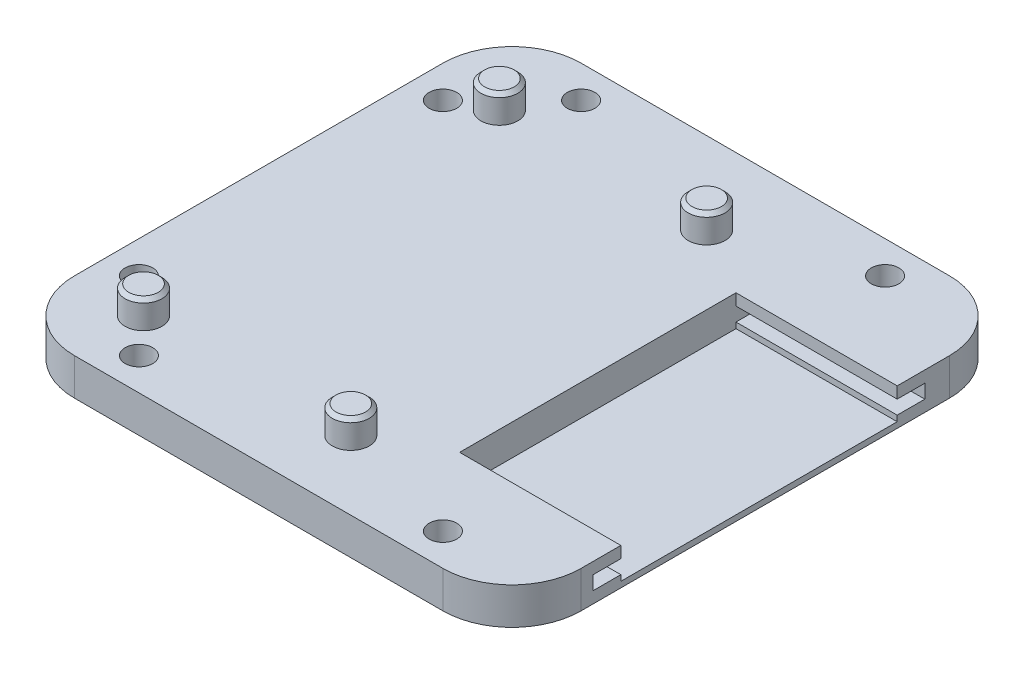
ISO-10303-21;
HEADER;
FILE_DESCRIPTION(('STEP AP214'),'2;1');
FILE_NAME('part.step','',(''),(''),'','','');
FILE_SCHEMA(('AUTOMOTIVE_DESIGN { 1 0 10303 214 1 1 1 1 }'));
ENDSEC;
DATA;
#1=APPLICATION_CONTEXT('core data for automotive mechanical design processes');
#2=APPLICATION_PROTOCOL_DEFINITION('international standard','automotive_design',2000,#1);
#3=PRODUCT_CONTEXT('',#1,'mechanical');
#4=PRODUCT('Part','Part','',(#3));
#5=PRODUCT_RELATED_PRODUCT_CATEGORY('part','',(#4));
#6=PRODUCT_DEFINITION_FORMATION('','',#4);
#7=PRODUCT_DEFINITION_CONTEXT('part definition',#1,'design');
#8=PRODUCT_DEFINITION('design','',#6,#7);
#9=PRODUCT_DEFINITION_SHAPE('','',#8);
#10=(LENGTH_UNIT() NAMED_UNIT(*) SI_UNIT(.MILLI.,.METRE.));
#11=(NAMED_UNIT(*) PLANE_ANGLE_UNIT() SI_UNIT($,.RADIAN.));
#12=(NAMED_UNIT(*) SI_UNIT($,.STERADIAN.) SOLID_ANGLE_UNIT());
#13=UNCERTAINTY_MEASURE_WITH_UNIT(LENGTH_MEASURE(1.E-05),#10,'distance_accuracy_value','');
#14=(GEOMETRIC_REPRESENTATION_CONTEXT(3) GLOBAL_UNCERTAINTY_ASSIGNED_CONTEXT((#13)) GLOBAL_UNIT_ASSIGNED_CONTEXT((#10,
#11,#12)) REPRESENTATION_CONTEXT('',''));
#15=CARTESIAN_POINT('',(0.,0.,0.));
#16=DIRECTION('',(0.,0.,1.));
#17=DIRECTION('',(1.,0.,0.));
#18=AXIS2_PLACEMENT_3D('',#15,#16,#17);
#19=CARTESIAN_POINT('',(39.6260891513363,8.,-41.3710064451003));
#20=DIRECTION('',(0.,1.,0.));
#21=DIRECTION('',(0.,0.,1.));
#22=AXIS2_PLACEMENT_3D('',#19,#20,#21);
#23=PLANE('',#22);
#24=CARTESIAN_POINT('',(-40.3739108486637,8.,-38.6289935548997));
#25=DIRECTION('',(0.,1.,0.));
#26=DIRECTION('',(0.,0.,1.));
#27=AXIS2_PLACEMENT_3D('',#24,#25,#26);
#28=CIRCLE('',#27,4.);
#29=CARTESIAN_POINT('',(-40.3739108486637,8.,-34.6289935548998));
#30=VERTEX_POINT('',#29);
#31=EDGE_CURVE('E196',#30,#30,#28,.T.);
#32=ORIENTED_EDGE('',*,*,#31,.F.);
#33=EDGE_LOOP('',(#32));
#34=FACE_BOUND('',#33,.T.);
#35=CARTESIAN_POINT('',(4.62608915133627,8.,-38.6289935548997));
#36=DIRECTION('',(0.,1.,0.));
#37=DIRECTION('',(0.,0.,1.));
#38=AXIS2_PLACEMENT_3D('',#35,#36,#37);
#39=CIRCLE('',#38,4.);
#40=CARTESIAN_POINT('',(4.62608915133627,8.,-34.6289935548997));
#41=VERTEX_POINT('',#40);
#42=EDGE_CURVE('E193',#41,#41,#39,.T.);
#43=ORIENTED_EDGE('',*,*,#42,.F.);
#44=EDGE_LOOP('',(#43));
#45=FACE_BOUND('',#44,.T.);
#46=CARTESIAN_POINT('',(-40.3739108486637,8.,38.6289935548997));
#47=DIRECTION('',(0.,1.,0.));
#48=DIRECTION('',(0.,0.,1.));
#49=AXIS2_PLACEMENT_3D('',#46,#47,#48);
#50=CIRCLE('',#49,4.);
#51=CARTESIAN_POINT('',(-40.3739108486637,8.,42.6289935548997));
#52=VERTEX_POINT('',#51);
#53=EDGE_CURVE('E582',#52,#52,#50,.T.);
#54=ORIENTED_EDGE('',*,*,#53,.F.);
#55=EDGE_LOOP('',(#54));
#56=FACE_BOUND('',#55,.T.);
#57=CARTESIAN_POINT('',(4.62608915133627,8.,38.6289935548997));
#58=DIRECTION('',(0.,1.,0.));
#59=DIRECTION('',(0.,0.,1.));
#60=AXIS2_PLACEMENT_3D('',#57,#58,#59);
#61=CIRCLE('',#60,4.);
#62=CARTESIAN_POINT('',(4.62608915133627,8.,42.6289935548998));
#63=VERTEX_POINT('',#62);
#64=EDGE_CURVE('E557',#63,#63,#61,.T.);
#65=ORIENTED_EDGE('',*,*,#64,.F.);
#66=EDGE_LOOP('',(#65));
#67=FACE_BOUND('',#66,.T.);
#68=DIRECTION('',(1.,0.,0.));
#69=VECTOR('',#68,1.);
#70=CARTESIAN_POINT('',(19.6260891513363,8.,-30.));
#71=LINE('',#70,#69);
#72=CARTESIAN_POINT('',(19.6260891513363,8.,-30.));
#73=VERTEX_POINT('',#72);
#74=CARTESIAN_POINT('',(54.6260891513363,8.,-30.));
#75=VERTEX_POINT('',#74);
#76=EDGE_CURVE('E437',#73,#75,#71,.T.);
#77=ORIENTED_EDGE('',*,*,#76,.T.);
#78=DIRECTION('',(0.,0.,-1.));
#79=VECTOR('',#78,1.);
#80=CARTESIAN_POINT('',(54.6260891513363,8.,38.6289935548997));
#81=LINE('',#80,#79);
#82=CARTESIAN_POINT('',(54.6260891513363,8.,-41.3710064451003));
#83=VERTEX_POINT('',#82);
#84=EDGE_CURVE('E60',#75,#83,#81,.T.);
#85=ORIENTED_EDGE('',*,*,#84,.T.);
#86=CARTESIAN_POINT('',(39.6260891513363,8.,-41.3710064451003));
#87=DIRECTION('',(0.,1.,0.));
#88=DIRECTION('',(0.,0.,1.));
#89=AXIS2_PLACEMENT_3D('',#86,#87,#88);
#90=CIRCLE('',#89,15.);
#91=CARTESIAN_POINT('',(39.6260891513363,8.,-56.3710064451003));
#92=VERTEX_POINT('',#91);
#93=EDGE_CURVE('E166',#83,#92,#90,.T.);
#94=ORIENTED_EDGE('',*,*,#93,.T.);
#95=DIRECTION('',(-1.,0.,0.));
#96=VECTOR('',#95,1.);
#97=CARTESIAN_POINT('',(39.6260891513363,8.,-56.3710064451003));
#98=LINE('',#97,#96);
#99=CARTESIAN_POINT('',(-40.3739108486637,8.,-56.3710064451003));
#100=VERTEX_POINT('',#99);
#101=EDGE_CURVE('E103',#92,#100,#98,.T.);
#102=ORIENTED_EDGE('',*,*,#101,.T.);
#103=CARTESIAN_POINT('',(-40.3739108486637,8.,-41.3710064451003));
#104=DIRECTION('',(0.,1.,0.));
#105=DIRECTION('',(0.,0.,1.));
#106=AXIS2_PLACEMENT_3D('',#103,#104,#105);
#107=CIRCLE('',#106,15.);
#108=CARTESIAN_POINT('',(-55.3739108486637,8.,-41.3710064451003));
#109=VERTEX_POINT('',#108);
#110=EDGE_CURVE('E400',#100,#109,#107,.T.);
#111=ORIENTED_EDGE('',*,*,#110,.T.);
#112=DIRECTION('',(0.,0.,1.));
#113=VECTOR('',#112,1.);
#114=CARTESIAN_POINT('',(-55.3739108486637,8.,-41.3710064451003));
#115=LINE('',#114,#113);
#116=CARTESIAN_POINT('',(-55.3739108486637,8.,38.6289935548997));
#117=VERTEX_POINT('',#116);
#118=EDGE_CURVE('E402',#109,#117,#115,.T.);
#119=ORIENTED_EDGE('',*,*,#118,.T.);
#120=CARTESIAN_POINT('',(-40.3739108486637,8.,38.6289935548997));
#121=DIRECTION('',(0.,1.,0.));
#122=DIRECTION('',(0.,0.,1.));
#123=AXIS2_PLACEMENT_3D('',#120,#121,#122);
#124=CIRCLE('',#123,15.);
#125=CARTESIAN_POINT('',(-40.3739108486637,8.,53.6289935548997));
#126=VERTEX_POINT('',#125);
#127=EDGE_CURVE('E127',#117,#126,#124,.T.);
#128=ORIENTED_EDGE('',*,*,#127,.T.);
#129=DIRECTION('',(1.,0.,0.));
#130=VECTOR('',#129,1.);
#131=CARTESIAN_POINT('',(-40.3739108486637,8.,53.6289935548997));
#132=LINE('',#131,#130);
#133=CARTESIAN_POINT('',(39.6260891513363,8.,53.6289935548997));
#134=VERTEX_POINT('',#133);
#135=EDGE_CURVE('E119',#126,#134,#132,.T.);
#136=ORIENTED_EDGE('',*,*,#135,.T.);
#137=CARTESIAN_POINT('',(39.6260891513363,8.,38.6289935548997));
#138=DIRECTION('',(0.,1.,0.));
#139=DIRECTION('',(0.,0.,1.));
#140=AXIS2_PLACEMENT_3D('',#137,#138,#139);
#141=CIRCLE('',#140,15.);
#142=CARTESIAN_POINT('',(54.6260891513363,8.,38.6289935548997));
#143=VERTEX_POINT('',#142);
#144=EDGE_CURVE('E124',#134,#143,#141,.T.);
#145=ORIENTED_EDGE('',*,*,#144,.T.);
#146=CARTESIAN_POINT('',(54.6260891513363,8.,30.));
#147=VERTEX_POINT('',#146);
#148=EDGE_CURVE('E145',#143,#147,#81,.T.);
#149=ORIENTED_EDGE('',*,*,#148,.T.);
#150=DIRECTION('',(1.,0.,0.));
#151=VECTOR('',#150,1.);
#152=CARTESIAN_POINT('',(19.6260891513363,8.,30.));
#153=LINE('',#152,#151);
#154=CARTESIAN_POINT('',(19.6260891513363,8.,30.));
#155=VERTEX_POINT('',#154);
#156=EDGE_CURVE('E51',#155,#147,#153,.T.);
#157=ORIENTED_EDGE('',*,*,#156,.F.);
#158=DIRECTION('',(0.,0.,1.));
#159=VECTOR('',#158,1.);
#160=CARTESIAN_POINT('',(19.6260891513363,8.,30.));
#161=LINE('',#160,#159);
#162=EDGE_CURVE('E416',#73,#155,#161,.T.);
#163=ORIENTED_EDGE('',*,*,#162,.F.);
#164=EDGE_LOOP('',(#77,#85,#94,#102,#111,#119,#128,#136,#145,#149,#157,#163));
#165=FACE_BOUND('',#164,.T.);
#166=CARTESIAN_POINT('',(-33.3739108486637,8.,46.6289935548998));
#167=DIRECTION('',(0.,1.,0.));
#168=DIRECTION('',(0.,0.,1.));
#169=AXIS2_PLACEMENT_3D('',#166,#167,#168);
#170=CIRCLE('',#169,3.00000000000001);
#171=CARTESIAN_POINT('',(-33.3739108486637,8.,49.6289935548998));
#172=VERTEX_POINT('',#171);
#173=EDGE_CURVE('E438',#172,#172,#170,.T.);
#174=ORIENTED_EDGE('',*,*,#173,.F.);
#175=EDGE_LOOP('',(#174));
#176=FACE_BOUND('',#175,.T.);
#177=CARTESIAN_POINT('',(32.6260891513363,8.,-49.3710064451002));
#178=DIRECTION('',(0.,1.,0.));
#179=DIRECTION('',(0.,0.,1.));
#180=AXIS2_PLACEMENT_3D('',#177,#178,#179);
#181=CIRCLE('',#180,2.99999999999997);
#182=CARTESIAN_POINT('',(32.6260891513363,8.,-46.3710064451003));
#183=VERTEX_POINT('',#182);
#184=EDGE_CURVE('E385',#183,#183,#181,.T.);
#185=ORIENTED_EDGE('',*,*,#184,.F.);
#186=EDGE_LOOP('',(#185));
#187=FACE_BOUND('',#186,.T.);
#188=CARTESIAN_POINT('',(-48.3739108486637,8.,-34.3710064451002));
#189=DIRECTION('',(0.,1.,0.));
#190=DIRECTION('',(0.,0.,1.));
#191=AXIS2_PLACEMENT_3D('',#188,#189,#190);
#192=CIRCLE('',#191,3.);
#193=CARTESIAN_POINT('',(-48.3739108486637,8.,-31.3710064451002));
#194=VERTEX_POINT('',#193);
#195=EDGE_CURVE('E154',#194,#194,#192,.T.);
#196=ORIENTED_EDGE('',*,*,#195,.F.);
#197=EDGE_LOOP('',(#196));
#198=FACE_BOUND('',#197,.T.);
#199=CARTESIAN_POINT('',(-33.3739108486637,8.,-49.3710064451003));
#200=DIRECTION('',(0.,1.,0.));
#201=DIRECTION('',(0.,0.,1.));
#202=AXIS2_PLACEMENT_3D('',#199,#200,#201);
#203=CIRCLE('',#202,3.00000000000001);
#204=CARTESIAN_POINT('',(-33.3739108486637,8.,-46.3710064451003));
#205=VERTEX_POINT('',#204);
#206=EDGE_CURVE('E380',#205,#205,#203,.T.);
#207=ORIENTED_EDGE('',*,*,#206,.F.);
#208=EDGE_LOOP('',(#207));
#209=FACE_BOUND('',#208,.T.);
#210=CARTESIAN_POINT('',(-48.3739108486637,8.,31.6289935548998));
#211=DIRECTION('',(0.,1.,0.));
#212=DIRECTION('',(0.,0.,1.));
#213=AXIS2_PLACEMENT_3D('',#210,#211,#212);
#214=CIRCLE('',#213,3.);
#215=CARTESIAN_POINT('',(-48.3739108486637,8.,34.6289935548998));
#216=VERTEX_POINT('',#215);
#217=EDGE_CURVE('E444',#216,#216,#214,.T.);
#218=ORIENTED_EDGE('',*,*,#217,.F.);
#219=EDGE_LOOP('',(#218));
#220=FACE_BOUND('',#219,.T.);
#221=CARTESIAN_POINT('',(32.6260891513363,8.,46.6289935548997));
#222=DIRECTION('',(0.,1.,0.));
#223=DIRECTION('',(0.,0.,1.));
#224=AXIS2_PLACEMENT_3D('',#221,#222,#223);
#225=CIRCLE('',#224,3.00000000000001);
#226=CARTESIAN_POINT('',(32.6260891513363,8.,49.6289935548998));
#227=VERTEX_POINT('',#226);
#228=EDGE_CURVE('E430',#227,#227,#225,.T.);
#229=ORIENTED_EDGE('',*,*,#228,.F.);
#230=EDGE_LOOP('',(#229));
#231=FACE_BOUND('',#230,.T.);
#232=ADVANCED_FACE('F35',(#34,#45,#56,#67,#165,#176,#187,#198,#209,#220,#231),#23,.T.);
#233=CARTESIAN_POINT('',(39.6260891513363,0.,-41.3710064451003));
#234=DIRECTION('',(0.,1.,0.));
#235=DIRECTION('',(0.,0.,1.));
#236=AXIS2_PLACEMENT_3D('',#233,#234,#235);
#237=PLANE('',#236);
#238=CARTESIAN_POINT('',(39.6260891513363,0.,-41.3710064451003));
#239=DIRECTION('',(0.,1.,0.));
#240=DIRECTION('',(0.,0.,1.));
#241=AXIS2_PLACEMENT_3D('',#238,#239,#240);
#242=CIRCLE('',#241,15.);
#243=CARTESIAN_POINT('',(54.6260891513363,0.,-41.3710064451003));
#244=VERTEX_POINT('',#243);
#245=CARTESIAN_POINT('',(39.6260891513363,0.,-56.3710064451003));
#246=VERTEX_POINT('',#245);
#247=EDGE_CURVE('E150',#244,#246,#242,.T.);
#248=ORIENTED_EDGE('',*,*,#247,.F.);
#249=DIRECTION('',(0.,0.,-1.));
#250=VECTOR('',#249,1.);
#251=CARTESIAN_POINT('',(54.6260891513363,0.,38.6289935548997));
#252=LINE('',#251,#250);
#253=CARTESIAN_POINT('',(54.6260891513363,0.,38.6289935548997));
#254=VERTEX_POINT('',#253);
#255=EDGE_CURVE('E94',#254,#244,#252,.T.);
#256=ORIENTED_EDGE('',*,*,#255,.F.);
#257=CARTESIAN_POINT('',(39.6260891513363,0.,38.6289935548997));
#258=DIRECTION('',(0.,1.,0.));
#259=DIRECTION('',(0.,0.,1.));
#260=AXIS2_PLACEMENT_3D('',#257,#258,#259);
#261=CIRCLE('',#260,15.);
#262=CARTESIAN_POINT('',(39.6260891513363,0.,53.6289935548997));
#263=VERTEX_POINT('',#262);
#264=EDGE_CURVE('E163',#263,#254,#261,.T.);
#265=ORIENTED_EDGE('',*,*,#264,.F.);
#266=DIRECTION('',(1.,0.,0.));
#267=VECTOR('',#266,1.);
#268=CARTESIAN_POINT('',(-40.3739108486637,0.,53.6289935548997));
#269=LINE('',#268,#267);
#270=CARTESIAN_POINT('',(-40.3739108486637,0.,53.6289935548997));
#271=VERTEX_POINT('',#270);
#272=EDGE_CURVE('E136',#271,#263,#269,.T.);
#273=ORIENTED_EDGE('',*,*,#272,.F.);
#274=CARTESIAN_POINT('',(-40.3739108486637,0.,38.6289935548997));
#275=DIRECTION('',(0.,1.,0.));
#276=DIRECTION('',(0.,0.,1.));
#277=AXIS2_PLACEMENT_3D('',#274,#275,#276);
#278=CIRCLE('',#277,15.);
#279=CARTESIAN_POINT('',(-55.3739108486637,0.,38.6289935548997));
#280=VERTEX_POINT('',#279);
#281=EDGE_CURVE('E160',#280,#271,#278,.T.);
#282=ORIENTED_EDGE('',*,*,#281,.F.);
#283=DIRECTION('',(0.,0.,1.));
#284=VECTOR('',#283,1.);
#285=CARTESIAN_POINT('',(-55.3739108486637,0.,-41.3710064451003));
#286=LINE('',#285,#284);
#287=CARTESIAN_POINT('',(-55.3739108486637,0.,-41.3710064451003));
#288=VERTEX_POINT('',#287);
#289=EDGE_CURVE('E158',#288,#280,#286,.T.);
#290=ORIENTED_EDGE('',*,*,#289,.F.);
#291=CARTESIAN_POINT('',(-40.3739108486637,0.,-41.3710064451003));
#292=DIRECTION('',(0.,1.,0.));
#293=DIRECTION('',(0.,0.,1.));
#294=AXIS2_PLACEMENT_3D('',#291,#292,#293);
#295=CIRCLE('',#294,15.);
#296=CARTESIAN_POINT('',(-40.3739108486637,0.,-56.3710064451003));
#297=VERTEX_POINT('',#296);
#298=EDGE_CURVE('E156',#297,#288,#295,.T.);
#299=ORIENTED_EDGE('',*,*,#298,.F.);
#300=DIRECTION('',(-1.,0.,0.));
#301=VECTOR('',#300,1.);
#302=CARTESIAN_POINT('',(39.6260891513363,0.,-56.3710064451003));
#303=LINE('',#302,#301);
#304=EDGE_CURVE('E153',#246,#297,#303,.T.);
#305=ORIENTED_EDGE('',*,*,#304,.F.);
#306=EDGE_LOOP('',(#248,#256,#265,#273,#282,#290,#299,#305));
#307=FACE_BOUND('',#306,.T.);
#308=CARTESIAN_POINT('',(-48.3739108486637,0.,-34.3710064451002));
#309=DIRECTION('',(0.,1.,0.));
#310=DIRECTION('',(0.,0.,1.));
#311=AXIS2_PLACEMENT_3D('',#308,#309,#310);
#312=CIRCLE('',#311,3.);
#313=CARTESIAN_POINT('',(-48.3739108486637,0.,-31.3710064451002));
#314=VERTEX_POINT('',#313);
#315=EDGE_CURVE('E387',#314,#314,#312,.T.);
#316=ORIENTED_EDGE('',*,*,#315,.T.);
#317=EDGE_LOOP('',(#316));
#318=FACE_BOUND('',#317,.T.);
#319=CARTESIAN_POINT('',(-33.3739108486637,0.,-49.3710064451003));
#320=DIRECTION('',(0.,1.,0.));
#321=DIRECTION('',(0.,0.,1.));
#322=AXIS2_PLACEMENT_3D('',#319,#320,#321);
#323=CIRCLE('',#322,3.00000000000001);
#324=CARTESIAN_POINT('',(-33.3739108486637,0.,-46.3710064451003));
#325=VERTEX_POINT('',#324);
#326=EDGE_CURVE('E383',#325,#325,#323,.T.);
#327=ORIENTED_EDGE('',*,*,#326,.T.);
#328=EDGE_LOOP('',(#327));
#329=FACE_BOUND('',#328,.T.);
#330=CARTESIAN_POINT('',(32.6260891513363,0.,-49.3710064451002));
#331=DIRECTION('',(0.,1.,0.));
#332=DIRECTION('',(0.,0.,1.));
#333=AXIS2_PLACEMENT_3D('',#330,#331,#332);
#334=CIRCLE('',#333,2.99999999999997);
#335=CARTESIAN_POINT('',(32.6260891513363,0.,-46.3710064451003));
#336=VERTEX_POINT('',#335);
#337=EDGE_CURVE('E390',#336,#336,#334,.T.);
#338=ORIENTED_EDGE('',*,*,#337,.T.);
#339=EDGE_LOOP('',(#338));
#340=FACE_BOUND('',#339,.T.);
#341=CARTESIAN_POINT('',(-48.3739108486637,0.,31.6289935548998));
#342=DIRECTION('',(0.,1.,0.));
#343=DIRECTION('',(0.,0.,1.));
#344=AXIS2_PLACEMENT_3D('',#341,#342,#343);
#345=CIRCLE('',#344,3.);
#346=CARTESIAN_POINT('',(-48.3739108486637,0.,34.6289935548998));
#347=VERTEX_POINT('',#346);
#348=EDGE_CURVE('E441',#347,#347,#345,.T.);
#349=ORIENTED_EDGE('',*,*,#348,.T.);
#350=EDGE_LOOP('',(#349));
#351=FACE_BOUND('',#350,.T.);
#352=CARTESIAN_POINT('',(-33.3739108486637,0.,46.6289935548998));
#353=DIRECTION('',(0.,1.,0.));
#354=DIRECTION('',(0.,0.,1.));
#355=AXIS2_PLACEMENT_3D('',#352,#353,#354);
#356=CIRCLE('',#355,3.00000000000001);
#357=CARTESIAN_POINT('',(-33.3739108486637,0.,49.6289935548998));
#358=VERTEX_POINT('',#357);
#359=EDGE_CURVE('E433',#358,#358,#356,.T.);
#360=ORIENTED_EDGE('',*,*,#359,.T.);
#361=EDGE_LOOP('',(#360));
#362=FACE_BOUND('',#361,.T.);
#363=CARTESIAN_POINT('',(32.6260891513363,0.,46.6289935548997));
#364=DIRECTION('',(0.,1.,0.));
#365=DIRECTION('',(0.,0.,1.));
#366=AXIS2_PLACEMENT_3D('',#363,#364,#365);
#367=CIRCLE('',#366,3.00000000000001);
#368=CARTESIAN_POINT('',(32.6260891513363,0.,49.6289935548998));
#369=VERTEX_POINT('',#368);
#370=EDGE_CURVE('E434',#369,#369,#367,.T.);
#371=ORIENTED_EDGE('',*,*,#370,.T.);
#372=EDGE_LOOP('',(#371));
#373=FACE_BOUND('',#372,.T.);
#374=ADVANCED_FACE('F220',(#307,#318,#329,#340,#351,#362,#373),#237,.F.);
#375=CARTESIAN_POINT('',(39.6260891513363,8.,-41.3710064451003));
#376=DIRECTION('',(0.,-1.,0.));
#377=DIRECTION('',(0.,0.,-1.));
#378=AXIS2_PLACEMENT_3D('',#375,#376,#377);
#379=CYLINDRICAL_SURFACE('',#378,15.);
#380=ORIENTED_EDGE('',*,*,#247,.T.);
#381=DIRECTION('',(0.,-1.,0.));
#382=VECTOR('',#381,1.);
#383=CARTESIAN_POINT('',(39.6260891513363,8.,-56.3710064451003));
#384=LINE('',#383,#382);
#385=EDGE_CURVE('E179',#92,#246,#384,.T.);
#386=ORIENTED_EDGE('',*,*,#385,.F.);
#387=ORIENTED_EDGE('',*,*,#93,.F.);
#388=DIRECTION('',(0.,-1.,0.));
#389=VECTOR('',#388,1.);
#390=CARTESIAN_POINT('',(54.6260891513363,8.,-41.3710064451003));
#391=LINE('',#390,#389);
#392=EDGE_CURVE('E149',#83,#244,#391,.T.);
#393=ORIENTED_EDGE('',*,*,#392,.T.);
#394=EDGE_LOOP('',(#380,#386,#387,#393));
#395=FACE_BOUND('',#394,.T.);
#396=ADVANCED_FACE('F226',(#395),#379,.T.);
#397=CARTESIAN_POINT('',(39.6260891513363,8.,-56.3710064451003));
#398=DIRECTION('',(0.,0.,1.));
#399=DIRECTION('',(1.,0.,0.));
#400=AXIS2_PLACEMENT_3D('',#397,#398,#399);
#401=PLANE('',#400);
#402=ORIENTED_EDGE('',*,*,#304,.T.);
#403=DIRECTION('',(0.,-1.,0.));
#404=VECTOR('',#403,1.);
#405=CARTESIAN_POINT('',(-40.3739108486637,8.,-56.3710064451003));
#406=LINE('',#405,#404);
#407=EDGE_CURVE('E176',#100,#297,#406,.T.);
#408=ORIENTED_EDGE('',*,*,#407,.F.);
#409=ORIENTED_EDGE('',*,*,#101,.F.);
#410=ORIENTED_EDGE('',*,*,#385,.T.);
#411=EDGE_LOOP('',(#402,#408,#409,#410));
#412=FACE_BOUND('',#411,.T.);
#413=ADVANCED_FACE('F253',(#412),#401,.F.);
#414=CARTESIAN_POINT('',(-40.3739108486637,8.,-41.3710064451003));
#415=DIRECTION('',(0.,-1.,0.));
#416=DIRECTION('',(0.,0.,-1.));
#417=AXIS2_PLACEMENT_3D('',#414,#415,#416);
#418=CYLINDRICAL_SURFACE('',#417,15.);
#419=ORIENTED_EDGE('',*,*,#298,.T.);
#420=DIRECTION('',(0.,-1.,0.));
#421=VECTOR('',#420,1.);
#422=CARTESIAN_POINT('',(-55.3739108486637,8.,-41.3710064451003));
#423=LINE('',#422,#421);
#424=EDGE_CURVE('E173',#109,#288,#423,.T.);
#425=ORIENTED_EDGE('',*,*,#424,.F.);
#426=ORIENTED_EDGE('',*,*,#110,.F.);
#427=ORIENTED_EDGE('',*,*,#407,.T.);
#428=EDGE_LOOP('',(#419,#425,#426,#427));
#429=FACE_BOUND('',#428,.T.);
#430=ADVANCED_FACE('F249',(#429),#418,.T.);
#431=CARTESIAN_POINT('',(-55.3739108486637,8.,-41.3710064451003));
#432=DIRECTION('',(1.,0.,0.));
#433=DIRECTION('',(0.,0.,-1.));
#434=AXIS2_PLACEMENT_3D('',#431,#432,#433);
#435=PLANE('',#434);
#436=ORIENTED_EDGE('',*,*,#289,.T.);
#437=DIRECTION('',(0.,-1.,0.));
#438=VECTOR('',#437,1.);
#439=CARTESIAN_POINT('',(-55.3739108486637,8.,38.6289935548997));
#440=LINE('',#439,#438);
#441=EDGE_CURVE('E170',#117,#280,#440,.T.);
#442=ORIENTED_EDGE('',*,*,#441,.F.);
#443=ORIENTED_EDGE('',*,*,#118,.F.);
#444=ORIENTED_EDGE('',*,*,#424,.T.);
#445=EDGE_LOOP('',(#436,#442,#443,#444));
#446=FACE_BOUND('',#445,.T.);
#447=ADVANCED_FACE('F245',(#446),#435,.F.);
#448=CARTESIAN_POINT('',(-40.3739108486637,8.,38.6289935548997));
#449=DIRECTION('',(0.,-1.,0.));
#450=DIRECTION('',(0.,0.,-1.));
#451=AXIS2_PLACEMENT_3D('',#448,#449,#450);
#452=CYLINDRICAL_SURFACE('',#451,15.);
#453=ORIENTED_EDGE('',*,*,#281,.T.);
#454=DIRECTION('',(0.,-1.,0.));
#455=VECTOR('',#454,1.);
#456=CARTESIAN_POINT('',(-40.3739108486637,8.,53.6289935548997));
#457=LINE('',#456,#455);
#458=EDGE_CURVE('E139',#126,#271,#457,.T.);
#459=ORIENTED_EDGE('',*,*,#458,.F.);
#460=ORIENTED_EDGE('',*,*,#127,.F.);
#461=ORIENTED_EDGE('',*,*,#441,.T.);
#462=EDGE_LOOP('',(#453,#459,#460,#461));
#463=FACE_BOUND('',#462,.T.);
#464=ADVANCED_FACE('F242',(#463),#452,.T.);
#465=CARTESIAN_POINT('',(-40.3739108486637,8.,53.6289935548997));
#466=DIRECTION('',(0.,0.,-1.));
#467=DIRECTION('',(-1.,0.,0.));
#468=AXIS2_PLACEMENT_3D('',#465,#466,#467);
#469=PLANE('',#468);
#470=ORIENTED_EDGE('',*,*,#272,.T.);
#471=DIRECTION('',(0.,-1.,0.));
#472=VECTOR('',#471,1.);
#473=CARTESIAN_POINT('',(39.6260891513363,8.,53.6289935548997));
#474=LINE('',#473,#472);
#475=EDGE_CURVE('E133',#134,#263,#474,.T.);
#476=ORIENTED_EDGE('',*,*,#475,.F.);
#477=ORIENTED_EDGE('',*,*,#135,.F.);
#478=ORIENTED_EDGE('',*,*,#458,.T.);
#479=EDGE_LOOP('',(#470,#476,#477,#478));
#480=FACE_BOUND('',#479,.T.);
#481=ADVANCED_FACE('F134',(#480),#469,.F.);
#482=CARTESIAN_POINT('',(39.6260891513363,8.,38.6289935548997));
#483=DIRECTION('',(0.,-1.,0.));
#484=DIRECTION('',(0.,0.,-1.));
#485=AXIS2_PLACEMENT_3D('',#482,#483,#484);
#486=CYLINDRICAL_SURFACE('',#485,15.);
#487=ORIENTED_EDGE('',*,*,#264,.T.);
#488=DIRECTION('',(0.,-1.,0.));
#489=VECTOR('',#488,1.);
#490=CARTESIAN_POINT('',(54.6260891513363,8.,38.6289935548997));
#491=LINE('',#490,#489);
#492=EDGE_CURVE('E140',#143,#254,#491,.T.);
#493=ORIENTED_EDGE('',*,*,#492,.F.);
#494=ORIENTED_EDGE('',*,*,#144,.F.);
#495=ORIENTED_EDGE('',*,*,#475,.T.);
#496=EDGE_LOOP('',(#487,#493,#494,#495));
#497=FACE_BOUND('',#496,.T.);
#498=ADVANCED_FACE('F142',(#497),#486,.T.);
#499=CARTESIAN_POINT('',(54.6260891513363,8.,38.6289935548997));
#500=DIRECTION('',(-1.,0.,0.));
#501=DIRECTION('',(0.,0.,1.));
#502=AXIS2_PLACEMENT_3D('',#499,#500,#501);
#503=PLANE('',#502);
#504=ORIENTED_EDGE('',*,*,#84,.F.);
#505=DIRECTION('',(0.,1.,0.));
#506=VECTOR('',#505,1.);
#507=CARTESIAN_POINT('',(54.6260891513363,8.,-30.));
#508=LINE('',#507,#506);
#509=CARTESIAN_POINT('',(54.6260891513363,5.5,-30.));
#510=VERTEX_POINT('',#509);
#511=EDGE_CURVE('E480',#510,#75,#508,.T.);
#512=ORIENTED_EDGE('',*,*,#511,.F.);
#513=DIRECTION('',(0.,0.,1.));
#514=VECTOR('',#513,1.);
#515=CARTESIAN_POINT('',(54.6260891513363,5.5,-30.));
#516=LINE('',#515,#514);
#517=CARTESIAN_POINT('',(54.6260891513363,5.5,-36.));
#518=VERTEX_POINT('',#517);
#519=EDGE_CURVE('E544',#518,#510,#516,.T.);
#520=ORIENTED_EDGE('',*,*,#519,.F.);
#521=DIRECTION('',(0.,1.,0.));
#522=VECTOR('',#521,1.);
#523=CARTESIAN_POINT('',(54.6260891513363,5.5,-36.));
#524=LINE('',#523,#522);
#525=CARTESIAN_POINT('',(54.6260891513363,2.5,-36.));
#526=VERTEX_POINT('',#525);
#527=EDGE_CURVE('E542',#526,#518,#524,.T.);
#528=ORIENTED_EDGE('',*,*,#527,.F.);
#529=DIRECTION('',(0.,0.,-1.));
#530=VECTOR('',#529,1.);
#531=CARTESIAN_POINT('',(54.6260891513363,2.5,-36.));
#532=LINE('',#531,#530);
#533=CARTESIAN_POINT('',(54.6260891513363,2.5,-30.));
#534=VERTEX_POINT('',#533);
#535=EDGE_CURVE('E539',#534,#526,#532,.T.);
#536=ORIENTED_EDGE('',*,*,#535,.F.);
#537=DIRECTION('',(0.,1.,0.));
#538=VECTOR('',#537,1.);
#539=CARTESIAN_POINT('',(54.6260891513363,2.5,-30.));
#540=LINE('',#539,#538);
#541=CARTESIAN_POINT('',(54.6260891513363,1.25,-30.));
#542=VERTEX_POINT('',#541);
#543=EDGE_CURVE('E536',#542,#534,#540,.T.);
#544=ORIENTED_EDGE('',*,*,#543,.F.);
#545=DIRECTION('',(0.,0.,-1.));
#546=VECTOR('',#545,1.);
#547=CARTESIAN_POINT('',(54.6260891513363,1.25,30.));
#548=LINE('',#547,#546);
#549=CARTESIAN_POINT('',(54.6260891513363,1.25,30.));
#550=VERTEX_POINT('',#549);
#551=EDGE_CURVE('E533',#550,#542,#548,.T.);
#552=ORIENTED_EDGE('',*,*,#551,.F.);
#553=DIRECTION('',(0.,-1.,0.));
#554=VECTOR('',#553,1.);
#555=CARTESIAN_POINT('',(54.6260891513363,2.5,30.));
#556=LINE('',#555,#554);
#557=CARTESIAN_POINT('',(54.6260891513363,2.5,30.));
#558=VERTEX_POINT('',#557);
#559=EDGE_CURVE('E527',#558,#550,#556,.T.);
#560=ORIENTED_EDGE('',*,*,#559,.F.);
#561=DIRECTION('',(0.,0.,-1.));
#562=VECTOR('',#561,1.);
#563=CARTESIAN_POINT('',(54.6260891513363,2.5,36.));
#564=LINE('',#563,#562);
#565=CARTESIAN_POINT('',(54.6260891513363,2.5,36.));
#566=VERTEX_POINT('',#565);
#567=EDGE_CURVE('E525',#566,#558,#564,.T.);
#568=ORIENTED_EDGE('',*,*,#567,.F.);
#569=DIRECTION('',(0.,-1.,0.));
#570=VECTOR('',#569,1.);
#571=CARTESIAN_POINT('',(54.6260891513363,5.5,36.));
#572=LINE('',#571,#570);
#573=CARTESIAN_POINT('',(54.6260891513363,5.5,36.));
#574=VERTEX_POINT('',#573);
#575=EDGE_CURVE('E511',#574,#566,#572,.T.);
#576=ORIENTED_EDGE('',*,*,#575,.F.);
#577=DIRECTION('',(0.,0.,1.));
#578=VECTOR('',#577,1.);
#579=CARTESIAN_POINT('',(54.6260891513363,5.5,30.));
#580=LINE('',#579,#578);
#581=CARTESIAN_POINT('',(54.6260891513363,5.5,30.));
#582=VERTEX_POINT('',#581);
#583=EDGE_CURVE('E520',#582,#574,#580,.T.);
#584=ORIENTED_EDGE('',*,*,#583,.F.);
#585=DIRECTION('',(0.,-1.,0.));
#586=VECTOR('',#585,1.);
#587=CARTESIAN_POINT('',(54.6260891513363,8.,30.));
#588=LINE('',#587,#586);
#589=EDGE_CURVE('E412',#147,#582,#588,.T.);
#590=ORIENTED_EDGE('',*,*,#589,.F.);
#591=ORIENTED_EDGE('',*,*,#148,.F.);
#592=ORIENTED_EDGE('',*,*,#492,.T.);
#593=ORIENTED_EDGE('',*,*,#255,.T.);
#594=ORIENTED_EDGE('',*,*,#392,.F.);
#595=EDGE_LOOP('',(#504,#512,#520,#528,#536,#544,#552,#560,#568,#576,#584,#590,#591,#592,#593,#594));
#596=FACE_BOUND('',#595,.T.);
#597=ADVANCED_FACE('F235',(#596),#503,.F.);
#598=CARTESIAN_POINT('',(-48.3739108486637,8.,-34.3710064451002));
#599=DIRECTION('',(0.,-1.,0.));
#600=DIRECTION('',(0.,0.,-1.));
#601=AXIS2_PLACEMENT_3D('',#598,#599,#600);
#602=CYLINDRICAL_SURFACE('',#601,3.);
#603=ORIENTED_EDGE('',*,*,#195,.T.);
#604=EDGE_LOOP('',(#603));
#605=FACE_BOUND('',#604,.T.);
#606=ORIENTED_EDGE('',*,*,#315,.F.);
#607=EDGE_LOOP('',(#606));
#608=FACE_BOUND('',#607,.T.);
#609=ADVANCED_FACE('F232',(#605,#608),#602,.F.);
#610=CARTESIAN_POINT('',(-33.3739108486637,8.,-49.3710064451003));
#611=DIRECTION('',(0.,-1.,0.));
#612=DIRECTION('',(0.,0.,-1.));
#613=AXIS2_PLACEMENT_3D('',#610,#611,#612);
#614=CYLINDRICAL_SURFACE('',#613,3.00000000000001);
#615=ORIENTED_EDGE('',*,*,#206,.T.);
#616=EDGE_LOOP('',(#615));
#617=FACE_BOUND('',#616,.T.);
#618=ORIENTED_EDGE('',*,*,#326,.F.);
#619=EDGE_LOOP('',(#618));
#620=FACE_BOUND('',#619,.T.);
#621=ADVANCED_FACE('F369',(#617,#620),#614,.F.);
#622=CARTESIAN_POINT('',(32.6260891513363,8.,-49.3710064451002));
#623=DIRECTION('',(0.,-1.,0.));
#624=DIRECTION('',(0.,0.,-1.));
#625=AXIS2_PLACEMENT_3D('',#622,#623,#624);
#626=CYLINDRICAL_SURFACE('',#625,2.99999999999997);
#627=ORIENTED_EDGE('',*,*,#184,.T.);
#628=EDGE_LOOP('',(#627));
#629=FACE_BOUND('',#628,.T.);
#630=ORIENTED_EDGE('',*,*,#337,.F.);
#631=EDGE_LOOP('',(#630));
#632=FACE_BOUND('',#631,.T.);
#633=ADVANCED_FACE('F366',(#629,#632),#626,.F.);
#634=CARTESIAN_POINT('',(-48.3739108486637,8.,31.6289935548998));
#635=DIRECTION('',(0.,-1.,0.));
#636=DIRECTION('',(0.,0.,-1.));
#637=AXIS2_PLACEMENT_3D('',#634,#635,#636);
#638=CYLINDRICAL_SURFACE('',#637,3.);
#639=ORIENTED_EDGE('',*,*,#217,.T.);
#640=EDGE_LOOP('',(#639));
#641=FACE_BOUND('',#640,.T.);
#642=ORIENTED_EDGE('',*,*,#348,.F.);
#643=EDGE_LOOP('',(#642));
#644=FACE_BOUND('',#643,.T.);
#645=ADVANCED_FACE('F362',(#641,#644),#638,.F.);
#646=CARTESIAN_POINT('',(-33.3739108486637,8.,46.6289935548998));
#647=DIRECTION('',(0.,-1.,0.));
#648=DIRECTION('',(0.,0.,-1.));
#649=AXIS2_PLACEMENT_3D('',#646,#647,#648);
#650=CYLINDRICAL_SURFACE('',#649,3.00000000000001);
#651=ORIENTED_EDGE('',*,*,#173,.T.);
#652=EDGE_LOOP('',(#651));
#653=FACE_BOUND('',#652,.T.);
#654=ORIENTED_EDGE('',*,*,#359,.F.);
#655=EDGE_LOOP('',(#654));
#656=FACE_BOUND('',#655,.T.);
#657=ADVANCED_FACE('F358',(#653,#656),#650,.F.);
#658=CARTESIAN_POINT('',(32.6260891513363,8.,46.6289935548997));
#659=DIRECTION('',(0.,-1.,0.));
#660=DIRECTION('',(0.,0.,-1.));
#661=AXIS2_PLACEMENT_3D('',#658,#659,#660);
#662=CYLINDRICAL_SURFACE('',#661,3.00000000000001);
#663=ORIENTED_EDGE('',*,*,#228,.T.);
#664=EDGE_LOOP('',(#663));
#665=FACE_BOUND('',#664,.T.);
#666=ORIENTED_EDGE('',*,*,#370,.F.);
#667=EDGE_LOOP('',(#666));
#668=FACE_BOUND('',#667,.T.);
#669=ADVANCED_FACE('F317',(#665,#668),#662,.F.);
#670=CARTESIAN_POINT('',(19.6260891513363,8.,-30.));
#671=DIRECTION('',(0.,0.,-1.));
#672=DIRECTION('',(-1.,0.,0.));
#673=AXIS2_PLACEMENT_3D('',#670,#671,#672);
#674=PLANE('',#673);
#675=ORIENTED_EDGE('',*,*,#511,.T.);
#676=ORIENTED_EDGE('',*,*,#76,.F.);
#677=DIRECTION('',(0.,1.,0.));
#678=VECTOR('',#677,1.);
#679=CARTESIAN_POINT('',(19.6260891513363,8.,-30.));
#680=LINE('',#679,#678);
#681=CARTESIAN_POINT('',(19.6260891513363,5.5,-30.));
#682=VERTEX_POINT('',#681);
#683=EDGE_CURVE('E420',#682,#73,#680,.T.);
#684=ORIENTED_EDGE('',*,*,#683,.F.);
#685=DIRECTION('',(1.,0.,0.));
#686=VECTOR('',#685,1.);
#687=CARTESIAN_POINT('',(19.6260891513363,5.5,-30.));
#688=LINE('',#687,#686);
#689=EDGE_CURVE('E473',#682,#510,#688,.T.);
#690=ORIENTED_EDGE('',*,*,#689,.T.);
#691=EDGE_LOOP('',(#675,#676,#684,#690));
#692=FACE_BOUND('',#691,.T.);
#693=ADVANCED_FACE('F313',(#692),#674,.F.);
#694=CARTESIAN_POINT('',(19.6260891513363,5.5,-30.));
#695=DIRECTION('',(0.,1.,0.));
#696=DIRECTION('',(0.,0.,1.));
#697=AXIS2_PLACEMENT_3D('',#694,#695,#696);
#698=PLANE('',#697);
#699=ORIENTED_EDGE('',*,*,#519,.T.);
#700=ORIENTED_EDGE('',*,*,#689,.F.);
#701=DIRECTION('',(0.,0.,1.));
#702=VECTOR('',#701,1.);
#703=CARTESIAN_POINT('',(19.6260891513363,5.5,-30.));
#704=LINE('',#703,#702);
#705=CARTESIAN_POINT('',(19.6260891513363,5.5,-36.));
#706=VERTEX_POINT('',#705);
#707=EDGE_CURVE('E426',#706,#682,#704,.T.);
#708=ORIENTED_EDGE('',*,*,#707,.F.);
#709=DIRECTION('',(1.,0.,0.));
#710=VECTOR('',#709,1.);
#711=CARTESIAN_POINT('',(19.6260891513363,5.5,-36.));
#712=LINE('',#711,#710);
#713=EDGE_CURVE('E477',#706,#518,#712,.T.);
#714=ORIENTED_EDGE('',*,*,#713,.T.);
#715=EDGE_LOOP('',(#699,#700,#708,#714));
#716=FACE_BOUND('',#715,.T.);
#717=ADVANCED_FACE('F316',(#716),#698,.F.);
#718=CARTESIAN_POINT('',(19.6260891513363,5.5,-36.));
#719=DIRECTION('',(0.,0.,-1.));
#720=DIRECTION('',(-1.,0.,0.));
#721=AXIS2_PLACEMENT_3D('',#718,#719,#720);
#722=PLANE('',#721);
#723=ORIENTED_EDGE('',*,*,#527,.T.);
#724=ORIENTED_EDGE('',*,*,#713,.F.);
#725=DIRECTION('',(0.,1.,0.));
#726=VECTOR('',#725,1.);
#727=CARTESIAN_POINT('',(19.6260891513363,5.5,-36.));
#728=LINE('',#727,#726);
#729=CARTESIAN_POINT('',(19.6260891513363,2.5,-36.));
#730=VERTEX_POINT('',#729);
#731=EDGE_CURVE('E577',#730,#706,#728,.T.);
#732=ORIENTED_EDGE('',*,*,#731,.F.);
#733=DIRECTION('',(1.,0.,0.));
#734=VECTOR('',#733,1.);
#735=CARTESIAN_POINT('',(19.6260891513363,2.5,-36.));
#736=LINE('',#735,#734);
#737=EDGE_CURVE('E485',#730,#526,#736,.T.);
#738=ORIENTED_EDGE('',*,*,#737,.T.);
#739=EDGE_LOOP('',(#723,#724,#732,#738));
#740=FACE_BOUND('',#739,.T.);
#741=ADVANCED_FACE('F321',(#740),#722,.F.);
#742=CARTESIAN_POINT('',(19.6260891513363,2.5,-36.));
#743=DIRECTION('',(0.,-1.,0.));
#744=DIRECTION('',(0.,0.,-1.));
#745=AXIS2_PLACEMENT_3D('',#742,#743,#744);
#746=PLANE('',#745);
#747=ORIENTED_EDGE('',*,*,#535,.T.);
#748=ORIENTED_EDGE('',*,*,#737,.F.);
#749=DIRECTION('',(0.,0.,-1.));
#750=VECTOR('',#749,1.);
#751=CARTESIAN_POINT('',(19.6260891513363,2.5,-36.));
#752=LINE('',#751,#750);
#753=CARTESIAN_POINT('',(19.6260891513363,2.5,-30.));
#754=VERTEX_POINT('',#753);
#755=EDGE_CURVE('E574',#754,#730,#752,.T.);
#756=ORIENTED_EDGE('',*,*,#755,.F.);
#757=DIRECTION('',(1.,0.,0.));
#758=VECTOR('',#757,1.);
#759=CARTESIAN_POINT('',(19.6260891513363,2.5,-30.));
#760=LINE('',#759,#758);
#761=EDGE_CURVE('E488',#754,#534,#760,.T.);
#762=ORIENTED_EDGE('',*,*,#761,.T.);
#763=EDGE_LOOP('',(#747,#748,#756,#762));
#764=FACE_BOUND('',#763,.T.);
#765=ADVANCED_FACE('F325',(#764),#746,.F.);
#766=CARTESIAN_POINT('',(19.6260891513363,2.5,-30.));
#767=DIRECTION('',(0.,0.,-1.));
#768=DIRECTION('',(-1.,0.,0.));
#769=AXIS2_PLACEMENT_3D('',#766,#767,#768);
#770=PLANE('',#769);
#771=ORIENTED_EDGE('',*,*,#543,.T.);
#772=ORIENTED_EDGE('',*,*,#761,.F.);
#773=DIRECTION('',(0.,1.,0.));
#774=VECTOR('',#773,1.);
#775=CARTESIAN_POINT('',(19.6260891513363,2.5,-30.));
#776=LINE('',#775,#774);
#777=CARTESIAN_POINT('',(19.6260891513363,1.25,-30.));
#778=VERTEX_POINT('',#777);
#779=EDGE_CURVE('E571',#778,#754,#776,.T.);
#780=ORIENTED_EDGE('',*,*,#779,.F.);
#781=DIRECTION('',(1.,0.,0.));
#782=VECTOR('',#781,1.);
#783=CARTESIAN_POINT('',(19.6260891513363,1.25,-30.));
#784=LINE('',#783,#782);
#785=EDGE_CURVE('E491',#778,#542,#784,.T.);
#786=ORIENTED_EDGE('',*,*,#785,.T.);
#787=EDGE_LOOP('',(#771,#772,#780,#786));
#788=FACE_BOUND('',#787,.T.);
#789=ADVANCED_FACE('F329',(#788),#770,.F.);
#790=CARTESIAN_POINT('',(19.6260891513363,1.25,30.));
#791=DIRECTION('',(0.,-1.,0.));
#792=DIRECTION('',(0.,0.,-1.));
#793=AXIS2_PLACEMENT_3D('',#790,#791,#792);
#794=PLANE('',#793);
#795=ORIENTED_EDGE('',*,*,#551,.T.);
#796=ORIENTED_EDGE('',*,*,#785,.F.);
#797=DIRECTION('',(0.,0.,-1.));
#798=VECTOR('',#797,1.);
#799=CARTESIAN_POINT('',(19.6260891513363,1.25,30.));
#800=LINE('',#799,#798);
#801=CARTESIAN_POINT('',(19.6260891513363,1.25,30.));
#802=VERTEX_POINT('',#801);
#803=EDGE_CURVE('E568',#802,#778,#800,.T.);
#804=ORIENTED_EDGE('',*,*,#803,.F.);
#805=DIRECTION('',(1.,0.,0.));
#806=VECTOR('',#805,1.);
#807=CARTESIAN_POINT('',(19.6260891513363,1.25,30.));
#808=LINE('',#807,#806);
#809=EDGE_CURVE('E494',#802,#550,#808,.T.);
#810=ORIENTED_EDGE('',*,*,#809,.T.);
#811=EDGE_LOOP('',(#795,#796,#804,#810));
#812=FACE_BOUND('',#811,.T.);
#813=ADVANCED_FACE('F333',(#812),#794,.F.);
#814=CARTESIAN_POINT('',(19.6260891513363,2.5,30.));
#815=DIRECTION('',(0.,0.,1.));
#816=DIRECTION('',(1.,0.,0.));
#817=AXIS2_PLACEMENT_3D('',#814,#815,#816);
#818=PLANE('',#817);
#819=ORIENTED_EDGE('',*,*,#559,.T.);
#820=ORIENTED_EDGE('',*,*,#809,.F.);
#821=DIRECTION('',(0.,-1.,0.));
#822=VECTOR('',#821,1.);
#823=CARTESIAN_POINT('',(19.6260891513363,2.5,30.));
#824=LINE('',#823,#822);
#825=CARTESIAN_POINT('',(19.6260891513363,2.5,30.));
#826=VERTEX_POINT('',#825);
#827=EDGE_CURVE('E565',#826,#802,#824,.T.);
#828=ORIENTED_EDGE('',*,*,#827,.F.);
#829=DIRECTION('',(1.,0.,0.));
#830=VECTOR('',#829,1.);
#831=CARTESIAN_POINT('',(19.6260891513363,2.5,30.));
#832=LINE('',#831,#830);
#833=EDGE_CURVE('E497',#826,#558,#832,.T.);
#834=ORIENTED_EDGE('',*,*,#833,.T.);
#835=EDGE_LOOP('',(#819,#820,#828,#834));
#836=FACE_BOUND('',#835,.T.);
#837=ADVANCED_FACE('F337',(#836),#818,.F.);
#838=CARTESIAN_POINT('',(19.6260891513363,2.5,36.));
#839=DIRECTION('',(0.,-1.,0.));
#840=DIRECTION('',(0.,0.,-1.));
#841=AXIS2_PLACEMENT_3D('',#838,#839,#840);
#842=PLANE('',#841);
#843=ORIENTED_EDGE('',*,*,#567,.T.);
#844=ORIENTED_EDGE('',*,*,#833,.F.);
#845=DIRECTION('',(0.,0.,-1.));
#846=VECTOR('',#845,1.);
#847=CARTESIAN_POINT('',(19.6260891513363,2.5,36.));
#848=LINE('',#847,#846);
#849=CARTESIAN_POINT('',(19.6260891513363,2.5,36.));
#850=VERTEX_POINT('',#849);
#851=EDGE_CURVE('E562',#850,#826,#848,.T.);
#852=ORIENTED_EDGE('',*,*,#851,.F.);
#853=DIRECTION('',(1.,0.,0.));
#854=VECTOR('',#853,1.);
#855=CARTESIAN_POINT('',(19.6260891513363,2.5,36.));
#856=LINE('',#855,#854);
#857=EDGE_CURVE('E500',#850,#566,#856,.T.);
#858=ORIENTED_EDGE('',*,*,#857,.T.);
#859=EDGE_LOOP('',(#843,#844,#852,#858));
#860=FACE_BOUND('',#859,.T.);
#861=ADVANCED_FACE('F341',(#860),#842,.F.);
#862=CARTESIAN_POINT('',(19.6260891513363,5.5,36.));
#863=DIRECTION('',(0.,0.,1.));
#864=DIRECTION('',(1.,0.,0.));
#865=AXIS2_PLACEMENT_3D('',#862,#863,#864);
#866=PLANE('',#865);
#867=ORIENTED_EDGE('',*,*,#575,.T.);
#868=ORIENTED_EDGE('',*,*,#857,.F.);
#869=DIRECTION('',(0.,-1.,0.));
#870=VECTOR('',#869,1.);
#871=CARTESIAN_POINT('',(19.6260891513363,5.5,36.));
#872=LINE('',#871,#870);
#873=CARTESIAN_POINT('',(19.6260891513363,5.5,36.));
#874=VERTEX_POINT('',#873);
#875=EDGE_CURVE('E515',#874,#850,#872,.T.);
#876=ORIENTED_EDGE('',*,*,#875,.F.);
#877=DIRECTION('',(1.,0.,0.));
#878=VECTOR('',#877,1.);
#879=CARTESIAN_POINT('',(19.6260891513363,5.5,36.));
#880=LINE('',#879,#878);
#881=EDGE_CURVE('E423',#874,#574,#880,.T.);
#882=ORIENTED_EDGE('',*,*,#881,.T.);
#883=EDGE_LOOP('',(#867,#868,#876,#882));
#884=FACE_BOUND('',#883,.T.);
#885=ADVANCED_FACE('F345',(#884),#866,.F.);
#886=CARTESIAN_POINT('',(19.6260891513363,5.5,30.));
#887=DIRECTION('',(0.,1.,0.));
#888=DIRECTION('',(0.,0.,1.));
#889=AXIS2_PLACEMENT_3D('',#886,#887,#888);
#890=PLANE('',#889);
#891=ORIENTED_EDGE('',*,*,#583,.T.);
#892=ORIENTED_EDGE('',*,*,#881,.F.);
#893=DIRECTION('',(0.,0.,1.));
#894=VECTOR('',#893,1.);
#895=CARTESIAN_POINT('',(19.6260891513363,5.5,30.));
#896=LINE('',#895,#894);
#897=CARTESIAN_POINT('',(19.6260891513363,5.5,30.));
#898=VERTEX_POINT('',#897);
#899=EDGE_CURVE('E554',#898,#874,#896,.T.);
#900=ORIENTED_EDGE('',*,*,#899,.F.);
#901=DIRECTION('',(1.,0.,0.));
#902=VECTOR('',#901,1.);
#903=CARTESIAN_POINT('',(19.6260891513363,5.5,30.));
#904=LINE('',#903,#902);
#905=EDGE_CURVE('E419',#898,#582,#904,.T.);
#906=ORIENTED_EDGE('',*,*,#905,.T.);
#907=EDGE_LOOP('',(#891,#892,#900,#906));
#908=FACE_BOUND('',#907,.T.);
#909=ADVANCED_FACE('F349',(#908),#890,.F.);
#910=CARTESIAN_POINT('',(19.6260891513363,8.,30.));
#911=DIRECTION('',(0.,0.,1.));
#912=DIRECTION('',(1.,0.,0.));
#913=AXIS2_PLACEMENT_3D('',#910,#911,#912);
#914=PLANE('',#913);
#915=ORIENTED_EDGE('',*,*,#589,.T.);
#916=ORIENTED_EDGE('',*,*,#905,.F.);
#917=DIRECTION('',(0.,-1.,0.));
#918=VECTOR('',#917,1.);
#919=CARTESIAN_POINT('',(19.6260891513363,8.,30.));
#920=LINE('',#919,#918);
#921=EDGE_CURVE('E551',#155,#898,#920,.T.);
#922=ORIENTED_EDGE('',*,*,#921,.F.);
#923=ORIENTED_EDGE('',*,*,#156,.T.);
#924=EDGE_LOOP('',(#915,#916,#922,#923));
#925=FACE_BOUND('',#924,.T.);
#926=ADVANCED_FACE('F311',(#925),#914,.F.);
#927=CARTESIAN_POINT('',(19.6260891513363,0.,0.));
#928=DIRECTION('',(-1.,0.,0.));
#929=DIRECTION('',(0.,0.,1.));
#930=AXIS2_PLACEMENT_3D('',#927,#928,#929);
#931=PLANE('',#930);
#932=ORIENTED_EDGE('',*,*,#162,.T.);
#933=ORIENTED_EDGE('',*,*,#921,.T.);
#934=ORIENTED_EDGE('',*,*,#899,.T.);
#935=ORIENTED_EDGE('',*,*,#875,.T.);
#936=ORIENTED_EDGE('',*,*,#851,.T.);
#937=ORIENTED_EDGE('',*,*,#827,.T.);
#938=ORIENTED_EDGE('',*,*,#803,.T.);
#939=ORIENTED_EDGE('',*,*,#779,.T.);
#940=ORIENTED_EDGE('',*,*,#755,.T.);
#941=ORIENTED_EDGE('',*,*,#731,.T.);
#942=ORIENTED_EDGE('',*,*,#707,.T.);
#943=ORIENTED_EDGE('',*,*,#683,.T.);
#944=EDGE_LOOP('',(#932,#933,#934,#935,#936,#937,#938,#939,#940,#941,#942,#943));
#945=FACE_BOUND('',#944,.T.);
#946=ADVANCED_FACE('F307',(#945),#931,.F.);
#947=CARTESIAN_POINT('',(4.62608915133627,14.,38.6289935548997));
#948=DIRECTION('',(0.,-1.,0.));
#949=DIRECTION('',(0.,0.,-1.));
#950=AXIS2_PLACEMENT_3D('',#947,#948,#949);
#951=CYLINDRICAL_SURFACE('',#950,4.);
#952=CARTESIAN_POINT('',(4.62608915133627,13.2,38.6289935548997));
#953=DIRECTION('',(0.,1.,0.));
#954=DIRECTION('',(0.,0.,1.));
#955=AXIS2_PLACEMENT_3D('',#952,#953,#954);
#956=CIRCLE('',#955,4.);
#957=CARTESIAN_POINT('',(4.62608915133627,13.2,42.6289935548998));
#958=VERTEX_POINT('',#957);
#959=EDGE_CURVE('E184',#958,#958,#956,.F.);
#960=ORIENTED_EDGE('',*,*,#959,.T.);
#961=EDGE_LOOP('',(#960));
#962=FACE_BOUND('',#961,.T.);
#963=ORIENTED_EDGE('',*,*,#64,.T.);
#964=EDGE_LOOP('',(#963));
#965=FACE_BOUND('',#964,.T.);
#966=ADVANCED_FACE('F303',(#962,#965),#951,.T.);
#967=CARTESIAN_POINT('',(4.62608915133627,14.,38.6289935548997));
#968=DIRECTION('',(0.,1.,0.));
#969=DIRECTION('',(0.,0.,1.));
#970=AXIS2_PLACEMENT_3D('',#967,#968,#969);
#971=PLANE('',#970);
#972=CARTESIAN_POINT('',(4.62608915133627,14.,38.6289935548997));
#973=DIRECTION('',(0.,1.,0.));
#974=DIRECTION('',(0.,0.,1.));
#975=AXIS2_PLACEMENT_3D('',#972,#973,#974);
#976=CIRCLE('',#975,3.19999999999997);
#977=CARTESIAN_POINT('',(4.62608915133627,14.,41.8289935548997));
#978=VERTEX_POINT('',#977);
#979=EDGE_CURVE('E181',#978,#978,#976,.T.);
#980=ORIENTED_EDGE('',*,*,#979,.T.);
#981=EDGE_LOOP('',(#980));
#982=FACE_BOUND('',#981,.T.);
#983=ADVANCED_FACE('F296',(#982),#971,.T.);
#984=CARTESIAN_POINT('',(-40.3739108486637,14.,38.6289935548997));
#985=DIRECTION('',(0.,-1.,0.));
#986=DIRECTION('',(0.,0.,-1.));
#987=AXIS2_PLACEMENT_3D('',#984,#985,#986);
#988=CYLINDRICAL_SURFACE('',#987,4.);
#989=CARTESIAN_POINT('',(-40.3739108486637,13.2,38.6289935548997));
#990=DIRECTION('',(0.,1.,0.));
#991=DIRECTION('',(0.,0.,1.));
#992=AXIS2_PLACEMENT_3D('',#989,#990,#991);
#993=CIRCLE('',#992,4.);
#994=CARTESIAN_POINT('',(-40.3739108486637,13.2,42.6289935548997));
#995=VERTEX_POINT('',#994);
#996=EDGE_CURVE('E190',#995,#995,#993,.F.);
#997=ORIENTED_EDGE('',*,*,#996,.T.);
#998=EDGE_LOOP('',(#997));
#999=FACE_BOUND('',#998,.T.);
#1000=ORIENTED_EDGE('',*,*,#53,.T.);
#1001=EDGE_LOOP('',(#1000));
#1002=FACE_BOUND('',#1001,.T.);
#1003=ADVANCED_FACE('F291',(#999,#1002),#988,.T.);
#1004=CARTESIAN_POINT('',(-40.3739108486637,14.,38.6289935548997));
#1005=DIRECTION('',(0.,1.,0.));
#1006=DIRECTION('',(0.,0.,1.));
#1007=AXIS2_PLACEMENT_3D('',#1004,#1005,#1006);
#1008=PLANE('',#1007);
#1009=CARTESIAN_POINT('',(-40.3739108486637,14.,38.6289935548997));
#1010=DIRECTION('',(0.,1.,0.));
#1011=DIRECTION('',(0.,0.,1.));
#1012=AXIS2_PLACEMENT_3D('',#1009,#1010,#1011);
#1013=CIRCLE('',#1012,3.19999999999997);
#1014=CARTESIAN_POINT('',(-40.3739108486637,14.,41.8289935548997));
#1015=VERTEX_POINT('',#1014);
#1016=EDGE_CURVE('E187',#1015,#1015,#1013,.T.);
#1017=ORIENTED_EDGE('',*,*,#1016,.T.);
#1018=EDGE_LOOP('',(#1017));
#1019=FACE_BOUND('',#1018,.T.);
#1020=ADVANCED_FACE('F268',(#1019),#1008,.T.);
#1021=CARTESIAN_POINT('',(4.62608915133627,14.,38.6289935548997));
#1022=DIRECTION('',(0.,-1.,0.));
#1023=DIRECTION('',(0.,0.,-1.));
#1024=AXIS2_PLACEMENT_3D('',#1021,#1022,#1023);
#1025=CONICAL_SURFACE('',#1024,3.19999999999997,0.785398163397448);
#1026=ORIENTED_EDGE('',*,*,#959,.F.);
#1027=EDGE_LOOP('',(#1026));
#1028=FACE_BOUND('',#1027,.T.);
#1029=ORIENTED_EDGE('',*,*,#979,.F.);
#1030=EDGE_LOOP('',(#1029));
#1031=FACE_BOUND('',#1030,.T.);
#1032=ADVANCED_FACE('F261',(#1028,#1031),#1025,.T.);
#1033=CARTESIAN_POINT('',(-40.3739108486637,14.,38.6289935548997));
#1034=DIRECTION('',(0.,-1.,0.));
#1035=DIRECTION('',(0.,0.,-1.));
#1036=AXIS2_PLACEMENT_3D('',#1033,#1034,#1035);
#1037=CONICAL_SURFACE('',#1036,3.19999999999997,0.785398163397449);
#1038=ORIENTED_EDGE('',*,*,#996,.F.);
#1039=EDGE_LOOP('',(#1038));
#1040=FACE_BOUND('',#1039,.T.);
#1041=ORIENTED_EDGE('',*,*,#1016,.F.);
#1042=EDGE_LOOP('',(#1041));
#1043=FACE_BOUND('',#1042,.T.);
#1044=ADVANCED_FACE('F267',(#1040,#1043),#1037,.T.);
#1045=CARTESIAN_POINT('',(4.62608915133627,14.,-38.6289935548997));
#1046=DIRECTION('',(0.,-1.,0.));
#1047=DIRECTION('',(0.,0.,-1.));
#1048=AXIS2_PLACEMENT_3D('',#1045,#1046,#1047);
#1049=CYLINDRICAL_SURFACE('',#1048,4.);
#1050=CARTESIAN_POINT('',(4.62608915133627,13.2,-38.6289935548997));
#1051=DIRECTION('',(0.,1.,0.));
#1052=DIRECTION('',(0.,0.,1.));
#1053=AXIS2_PLACEMENT_3D('',#1050,#1051,#1052);
#1054=CIRCLE('',#1053,4.);
#1055=CARTESIAN_POINT('',(4.62608915133627,13.2,-34.6289935548997));
#1056=VERTEX_POINT('',#1055);
#1057=EDGE_CURVE('E199',#1056,#1056,#1054,.F.);
#1058=ORIENTED_EDGE('',*,*,#1057,.T.);
#1059=EDGE_LOOP('',(#1058));
#1060=FACE_BOUND('',#1059,.T.);
#1061=ORIENTED_EDGE('',*,*,#42,.T.);
#1062=EDGE_LOOP('',(#1061));
#1063=FACE_BOUND('',#1062,.T.);
#1064=ADVANCED_FACE('F274',(#1060,#1063),#1049,.T.);
#1065=CARTESIAN_POINT('',(4.62608915133627,14.,-38.6289935548997));
#1066=DIRECTION('',(0.,1.,0.));
#1067=DIRECTION('',(0.,0.,-1.));
#1068=AXIS2_PLACEMENT_3D('',#1065,#1066,#1067);
#1069=PLANE('',#1068);
#1070=CARTESIAN_POINT('',(4.62608915133627,14.,-38.6289935548997));
#1071=DIRECTION('',(0.,1.,0.));
#1072=DIRECTION('',(0.,0.,1.));
#1073=AXIS2_PLACEMENT_3D('',#1070,#1071,#1072);
#1074=CIRCLE('',#1073,3.19999999999997);
#1075=CARTESIAN_POINT('',(4.62608915133627,14.,-35.4289935548998));
#1076=VERTEX_POINT('',#1075);
#1077=EDGE_CURVE('E202',#1076,#1076,#1074,.T.);
#1078=ORIENTED_EDGE('',*,*,#1077,.T.);
#1079=EDGE_LOOP('',(#1078));
#1080=FACE_BOUND('',#1079,.T.);
#1081=ADVANCED_FACE('F283',(#1080),#1069,.T.);
#1082=CARTESIAN_POINT('',(-40.3739108486637,14.,-38.6289935548997));
#1083=DIRECTION('',(0.,-1.,0.));
#1084=DIRECTION('',(0.,0.,-1.));
#1085=AXIS2_PLACEMENT_3D('',#1082,#1083,#1084);
#1086=CYLINDRICAL_SURFACE('',#1085,4.);
#1087=CARTESIAN_POINT('',(-40.3739108486637,13.2,-38.6289935548997));
#1088=DIRECTION('',(0.,1.,0.));
#1089=DIRECTION('',(0.,0.,1.));
#1090=AXIS2_PLACEMENT_3D('',#1087,#1088,#1089);
#1091=CIRCLE('',#1090,4.);
#1092=CARTESIAN_POINT('',(-40.3739108486637,13.2,-34.6289935548998));
#1093=VERTEX_POINT('',#1092);
#1094=EDGE_CURVE('E44',#1093,#1093,#1091,.F.);
#1095=ORIENTED_EDGE('',*,*,#1094,.T.);
#1096=EDGE_LOOP('',(#1095));
#1097=FACE_BOUND('',#1096,.T.);
#1098=ORIENTED_EDGE('',*,*,#31,.T.);
#1099=EDGE_LOOP('',(#1098));
#1100=FACE_BOUND('',#1099,.T.);
#1101=ADVANCED_FACE('F207',(#1097,#1100),#1086,.T.);
#1102=CARTESIAN_POINT('',(-40.3739108486637,14.,-38.6289935548997));
#1103=DIRECTION('',(0.,1.,0.));
#1104=DIRECTION('',(0.,0.,-1.));
#1105=AXIS2_PLACEMENT_3D('',#1102,#1103,#1104);
#1106=PLANE('',#1105);
#1107=CARTESIAN_POINT('',(-40.3739108486637,14.,-38.6289935548997));
#1108=DIRECTION('',(0.,1.,0.));
#1109=DIRECTION('',(0.,0.,1.));
#1110=AXIS2_PLACEMENT_3D('',#1107,#1108,#1109);
#1111=CIRCLE('',#1110,3.19999999999997);
#1112=CARTESIAN_POINT('',(-40.3739108486637,14.,-35.4289935548998));
#1113=VERTEX_POINT('',#1112);
#1114=EDGE_CURVE('E11',#1113,#1113,#1111,.T.);
#1115=ORIENTED_EDGE('',*,*,#1114,.T.);
#1116=EDGE_LOOP('',(#1115));
#1117=FACE_BOUND('',#1116,.T.);
#1118=ADVANCED_FACE('F216',(#1117),#1106,.T.);
#1119=CARTESIAN_POINT('',(4.62608915133627,13.2,-38.6289935548997));
#1120=DIRECTION('',(0.,-1.,0.));
#1121=DIRECTION('',(0.,0.,-1.));
#1122=AXIS2_PLACEMENT_3D('',#1119,#1120,#1121);
#1123=CONICAL_SURFACE('',#1122,4.,0.785398163397448);
#1124=ORIENTED_EDGE('',*,*,#1077,.F.);
#1125=EDGE_LOOP('',(#1124));
#1126=FACE_BOUND('',#1125,.T.);
#1127=ORIENTED_EDGE('',*,*,#1057,.F.);
#1128=EDGE_LOOP('',(#1127));
#1129=FACE_BOUND('',#1128,.T.);
#1130=ADVANCED_FACE('F211',(#1126,#1129),#1123,.T.);
#1131=CARTESIAN_POINT('',(-40.3739108486637,13.2,-38.6289935548997));
#1132=DIRECTION('',(0.,-1.,0.));
#1133=DIRECTION('',(0.,0.,-1.));
#1134=AXIS2_PLACEMENT_3D('',#1131,#1132,#1133);
#1135=CONICAL_SURFACE('',#1134,4.,0.785398163397449);
#1136=ORIENTED_EDGE('',*,*,#1114,.F.);
#1137=EDGE_LOOP('',(#1136));
#1138=FACE_BOUND('',#1137,.T.);
#1139=ORIENTED_EDGE('',*,*,#1094,.F.);
#1140=EDGE_LOOP('',(#1139));
#1141=FACE_BOUND('',#1140,.T.);
#1142=ADVANCED_FACE('F38',(#1138,#1141),#1135,.T.);
#1143=CLOSED_SHELL('',(#232,#374,#396,#413,#430,#447,#464,#481,#498,#597,#609,#621,#633,#645,
#657,#669,#693,#717,#741,#765,#789,#813,#837,#861,#885,#909,#926,#946,#966,#983,#1003,#1020,
#1032,#1044,#1064,#1081,#1101,#1118,#1130,#1142));
#1144=MANIFOLD_SOLID_BREP('B2',#1143);
#1145=ADVANCED_BREP_SHAPE_REPRESENTATION('',(#18,#1144),#14);
#1146=SHAPE_DEFINITION_REPRESENTATION(#9,#1145);
ENDSEC;
END-ISO-10303-21;
